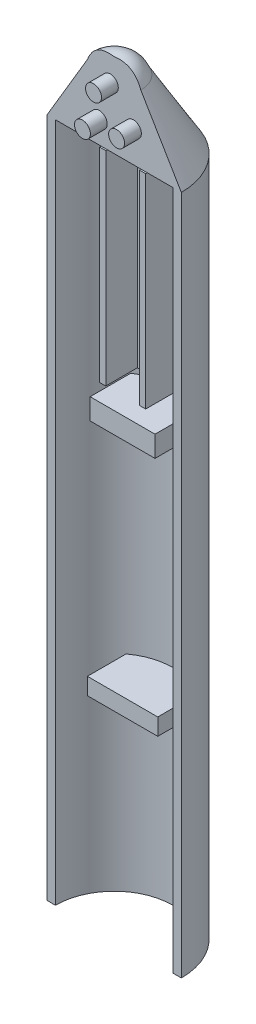
ISO-10303-21;
HEADER;
FILE_DESCRIPTION(('STEP AP214'),'2;1');
FILE_NAME('part.step','',(''),(''),'','','');
FILE_SCHEMA(('AUTOMOTIVE_DESIGN { 1 0 10303 214 1 1 1 1 }'));
ENDSEC;
DATA;
#1=APPLICATION_CONTEXT('core data for automotive mechanical design processes');
#2=APPLICATION_PROTOCOL_DEFINITION('international standard','automotive_design',2000,#1);
#3=PRODUCT_CONTEXT('',#1,'mechanical');
#4=PRODUCT('Part','Part','',(#3));
#5=PRODUCT_RELATED_PRODUCT_CATEGORY('part','',(#4));
#6=PRODUCT_DEFINITION_FORMATION('','',#4);
#7=PRODUCT_DEFINITION_CONTEXT('part definition',#1,'design');
#8=PRODUCT_DEFINITION('design','',#6,#7);
#9=PRODUCT_DEFINITION_SHAPE('','',#8);
#10=(LENGTH_UNIT() NAMED_UNIT(*) SI_UNIT(.MILLI.,.METRE.));
#11=(NAMED_UNIT(*) PLANE_ANGLE_UNIT() SI_UNIT($,.RADIAN.));
#12=(NAMED_UNIT(*) SI_UNIT($,.STERADIAN.) SOLID_ANGLE_UNIT());
#13=UNCERTAINTY_MEASURE_WITH_UNIT(LENGTH_MEASURE(1.E-05),#10,'distance_accuracy_value','');
#14=(GEOMETRIC_REPRESENTATION_CONTEXT(3) GLOBAL_UNCERTAINTY_ASSIGNED_CONTEXT((#13)) GLOBAL_UNIT_ASSIGNED_CONTEXT((#10,
#11,#12)) REPRESENTATION_CONTEXT('',''));
#15=CARTESIAN_POINT('',(0.,0.,0.));
#16=DIRECTION('',(0.,0.,1.));
#17=DIRECTION('',(1.,0.,0.));
#18=AXIS2_PLACEMENT_3D('',#15,#16,#17);
#19=CARTESIAN_POINT('',(-3.99999999999998,0.,-16.002));
#20=DIRECTION('',(1.,0.,0.));
#21=DIRECTION('',(0.,0.,-1.));
#22=AXIS2_PLACEMENT_3D('',#19,#20,#21);
#23=PLANE('',#22);
#24=DIRECTION('',(0.,0.,1.));
#25=VECTOR('',#24,1.);
#26=CARTESIAN_POINT('',(-3.99999999999998,20.0675731061453,-16.002));
#27=LINE('',#26,#25);
#28=CARTESIAN_POINT('',(-3.99999999999998,20.0675731061453,-9.5));
#29=VERTEX_POINT('',#28);
#30=CARTESIAN_POINT('',(-3.99999999999998,20.0675731061453,-2.));
#31=VERTEX_POINT('',#30);
#32=EDGE_CURVE('E61',#29,#31,#27,.T.);
#33=ORIENTED_EDGE('',*,*,#32,.F.);
#34=DIRECTION('',(0.,1.,0.));
#35=VECTOR('',#34,1.);
#36=CARTESIAN_POINT('',(-3.99999999999998,0.,-9.5));
#37=LINE('',#36,#35);
#38=CARTESIAN_POINT('',(-3.99999999999998,68.6220349905325,-9.5));
#39=VERTEX_POINT('',#38);
#40=EDGE_CURVE('E69',#29,#39,#37,.T.);
#41=ORIENTED_EDGE('',*,*,#40,.T.);
#42=DIRECTION('',(0.,0.,1.));
#43=VECTOR('',#42,1.);
#44=CARTESIAN_POINT('',(-3.99999999999998,68.6220349905325,-16.002));
#45=LINE('',#44,#43);
#46=CARTESIAN_POINT('',(-3.99999999999998,68.6220349905325,-2.));
#47=VERTEX_POINT('',#46);
#48=EDGE_CURVE('E212',#39,#47,#45,.T.);
#49=ORIENTED_EDGE('',*,*,#48,.T.);
#50=DIRECTION('',(0.,1.,0.));
#51=VECTOR('',#50,1.);
#52=CARTESIAN_POINT('',(-3.99999999999998,0.,-2.));
#53=LINE('',#52,#51);
#54=EDGE_CURVE('E232',#31,#47,#53,.T.);
#55=ORIENTED_EDGE('',*,*,#54,.F.);
#56=EDGE_LOOP('',(#33,#41,#49,#55));
#57=FACE_BOUND('',#56,.T.);
#58=ADVANCED_FACE('F50',(#57),#23,.T.);
#59=CARTESIAN_POINT('',(3.99999999999998,0.,-16.002));
#60=DIRECTION('',(1.,0.,0.));
#61=DIRECTION('',(0.,0.,-1.));
#62=AXIS2_PLACEMENT_3D('',#59,#60,#61);
#63=PLANE('',#62);
#64=DIRECTION('',(0.,1.,0.));
#65=VECTOR('',#64,1.);
#66=CARTESIAN_POINT('',(3.99999999999998,0.,-9.5));
#67=LINE('',#66,#65);
#68=CARTESIAN_POINT('',(3.99999999999998,20.0675731061453,-9.5));
#69=VERTEX_POINT('',#68);
#70=CARTESIAN_POINT('',(3.99999999999998,68.6220349905325,-9.5));
#71=VERTEX_POINT('',#70);
#72=EDGE_CURVE('E198',#69,#71,#67,.T.);
#73=ORIENTED_EDGE('',*,*,#72,.F.);
#74=DIRECTION('',(0.,0.,1.));
#75=VECTOR('',#74,1.);
#76=CARTESIAN_POINT('',(3.99999999999998,20.0675731061453,-16.002));
#77=LINE('',#76,#75);
#78=CARTESIAN_POINT('',(3.99999999999998,20.0675731061453,-2.));
#79=VERTEX_POINT('',#78);
#80=EDGE_CURVE('E320',#69,#79,#77,.T.);
#81=ORIENTED_EDGE('',*,*,#80,.T.);
#82=DIRECTION('',(0.,1.,0.));
#83=VECTOR('',#82,1.);
#84=CARTESIAN_POINT('',(3.99999999999998,0.,-2.));
#85=LINE('',#84,#83);
#86=CARTESIAN_POINT('',(3.99999999999998,68.6220349905325,-2.));
#87=VERTEX_POINT('',#86);
#88=EDGE_CURVE('E199',#79,#87,#85,.T.);
#89=ORIENTED_EDGE('',*,*,#88,.T.);
#90=DIRECTION('',(0.,0.,1.));
#91=VECTOR('',#90,1.);
#92=CARTESIAN_POINT('',(3.99999999999998,68.6220349905325,-16.002));
#93=LINE('',#92,#91);
#94=EDGE_CURVE('E195',#71,#87,#93,.T.);
#95=ORIENTED_EDGE('',*,*,#94,.F.);
#96=EDGE_LOOP('',(#73,#81,#89,#95));
#97=FACE_BOUND('',#96,.T.);
#98=ADVANCED_FACE('F191',(#97),#63,.F.);
#99=CARTESIAN_POINT('',(0.,91.,0.));
#100=DIRECTION('',(0.,1.,0.));
#101=DIRECTION('',(-1.,0.,0.));
#102=AXIS2_PLACEMENT_3D('',#99,#100,#101);
#103=CYLINDRICAL_SURFACE('',#102,14.);
#104=CARTESIAN_POINT('',(0.,-42.,0.));
#105=DIRECTION('',(0.,-1.,0.));
#106=DIRECTION('',(0.,0.,-1.));
#107=AXIS2_PLACEMENT_3D('',#104,#105,#106);
#108=CIRCLE('',#107,14.);
#109=CARTESIAN_POINT('',(-8.38159543616831,-42.,-11.2137798241451));
#110=VERTEX_POINT('',#109);
#111=CARTESIAN_POINT('',(8.38159543616828,-42.,-11.2137798241451));
#112=VERTEX_POINT('',#111);
#113=EDGE_CURVE('E286',#110,#112,#108,.T.);
#114=ORIENTED_EDGE('',*,*,#113,.T.);
#115=DIRECTION('',(0.,1.,0.));
#116=VECTOR('',#115,1.);
#117=CARTESIAN_POINT('',(8.38159543616828,91.,-11.2137798241451));
#118=LINE('',#117,#116);
#119=CARTESIAN_POINT('',(8.38159543616829,-46.,-11.2137798241451));
#120=VERTEX_POINT('',#119);
#121=EDGE_CURVE('E282',#120,#112,#118,.T.);
#122=ORIENTED_EDGE('',*,*,#121,.F.);
#123=CARTESIAN_POINT('',(0.,-46.,0.));
#124=DIRECTION('',(0.,-1.,0.));
#125=DIRECTION('',(0.,0.,-1.));
#126=AXIS2_PLACEMENT_3D('',#123,#124,#125);
#127=CIRCLE('',#126,14.);
#128=CARTESIAN_POINT('',(-8.38159543616832,-46.,-11.2137798241451));
#129=VERTEX_POINT('',#128);
#130=EDGE_CURVE('E291',#129,#120,#127,.T.);
#131=ORIENTED_EDGE('',*,*,#130,.F.);
#132=DIRECTION('',(0.,1.,0.));
#133=VECTOR('',#132,1.);
#134=CARTESIAN_POINT('',(-8.38159543616832,91.,-11.2137798241451));
#135=LINE('',#134,#133);
#136=EDGE_CURVE('E288',#129,#110,#135,.T.);
#137=ORIENTED_EDGE('',*,*,#136,.T.);
#138=EDGE_LOOP('',(#114,#122,#131,#137));
#139=FACE_BOUND('',#138,.T.);
#140=DIRECTION('',(0.,1.,0.));
#141=VECTOR('',#140,1.);
#142=CARTESIAN_POINT('',(14.,91.,0.));
#143=LINE('',#142,#141);
#144=CARTESIAN_POINT('',(14.,71.,0.));
#145=VERTEX_POINT('',#144);
#146=CARTESIAN_POINT('',(14.,-91.0399288571137,0.));
#147=VERTEX_POINT('',#146);
#148=EDGE_CURVE('E373',#145,#147,#143,.F.);
#149=ORIENTED_EDGE('',*,*,#148,.F.);
#150=CARTESIAN_POINT('',(0.,71.,0.));
#151=DIRECTION('',(0.,1.,0.));
#152=DIRECTION('',(-1.,0.,0.));
#153=AXIS2_PLACEMENT_3D('',#150,#151,#152);
#154=CIRCLE('',#153,14.);
#155=CARTESIAN_POINT('',(-14.,71.,0.));
#156=VERTEX_POINT('',#155);
#157=EDGE_CURVE('E60',#145,#156,#154,.T.);
#158=ORIENTED_EDGE('',*,*,#157,.T.);
#159=DIRECTION('',(0.,1.,0.));
#160=VECTOR('',#159,1.);
#161=CARTESIAN_POINT('',(-14.,91.,0.));
#162=LINE('',#161,#160);
#163=CARTESIAN_POINT('',(-14.,-91.0399288571137,0.));
#164=VERTEX_POINT('',#163);
#165=EDGE_CURVE('E359',#164,#156,#162,.T.);
#166=ORIENTED_EDGE('',*,*,#165,.F.);
#167=CARTESIAN_POINT('',(0.,-91.0399288571137,0.));
#168=DIRECTION('',(0.,1.,0.));
#169=DIRECTION('',(-1.,0.,0.));
#170=AXIS2_PLACEMENT_3D('',#167,#168,#169);
#171=CIRCLE('',#170,14.);
#172=EDGE_CURVE('E403',#147,#164,#171,.T.);
#173=ORIENTED_EDGE('',*,*,#172,.F.);
#174=EDGE_LOOP('',(#149,#158,#166,#173));
#175=FACE_BOUND('',#174,.T.);
#176=CARTESIAN_POINT('',(0.,16.,0.));
#177=DIRECTION('',(0.,-1.,0.));
#178=DIRECTION('',(1.,0.,0.));
#179=AXIS2_PLACEMENT_3D('',#176,#177,#178);
#180=CIRCLE('',#179,14.);
#181=CARTESIAN_POINT('',(-7.72890663595341,16.,-11.6732173034137));
#182=VERTEX_POINT('',#181);
#183=CARTESIAN_POINT('',(7.72890663595337,16.,-11.6732173034137));
#184=VERTEX_POINT('',#183);
#185=EDGE_CURVE('E363',#182,#184,#180,.T.);
#186=ORIENTED_EDGE('',*,*,#185,.T.);
#187=DIRECTION('',(0.,1.,0.));
#188=VECTOR('',#187,1.);
#189=CARTESIAN_POINT('',(7.72890663595337,91.,-11.6732173034136));
#190=LINE('',#189,#188);
#191=CARTESIAN_POINT('',(7.72890663595338,11.,-11.6732173034137));
#192=VERTEX_POINT('',#191);
#193=EDGE_CURVE('E358',#192,#184,#190,.T.);
#194=ORIENTED_EDGE('',*,*,#193,.F.);
#195=CARTESIAN_POINT('',(0.,11.,0.));
#196=DIRECTION('',(0.,-1.,0.));
#197=DIRECTION('',(1.,0.,0.));
#198=AXIS2_PLACEMENT_3D('',#195,#196,#197);
#199=CIRCLE('',#198,14.);
#200=CARTESIAN_POINT('',(-7.72890663595342,11.,-11.6732173034137));
#201=VERTEX_POINT('',#200);
#202=EDGE_CURVE('E364',#201,#192,#199,.T.);
#203=ORIENTED_EDGE('',*,*,#202,.F.);
#204=DIRECTION('',(0.,1.,0.));
#205=VECTOR('',#204,1.);
#206=CARTESIAN_POINT('',(-7.72890663595342,91.,-11.6732173034137));
#207=LINE('',#206,#205);
#208=EDGE_CURVE('E357',#201,#182,#207,.T.);
#209=ORIENTED_EDGE('',*,*,#208,.T.);
#210=EDGE_LOOP('',(#186,#194,#203,#209));
#211=FACE_BOUND('',#210,.T.);
#212=DIRECTION('',(0.,1.,0.));
#213=VECTOR('',#212,1.);
#214=CARTESIAN_POINT('',(-5.49999999999998,91.,-12.8743931895838));
#215=LINE('',#214,#213);
#216=CARTESIAN_POINT('',(-5.49999999999997,20.0675731061453,-12.8743931895838));
#217=VERTEX_POINT('',#216);
#218=CARTESIAN_POINT('',(-5.49999999999998,68.6220349905325,-12.8743931895838));
#219=VERTEX_POINT('',#218);
#220=EDGE_CURVE('E255',#217,#219,#215,.T.);
#221=ORIENTED_EDGE('',*,*,#220,.T.);
#222=CARTESIAN_POINT('',(0.,68.6220349905325,0.));
#223=DIRECTION('',(0.,1.,0.));
#224=DIRECTION('',(0.,0.,1.));
#225=AXIS2_PLACEMENT_3D('',#222,#223,#224);
#226=CIRCLE('',#225,14.);
#227=CARTESIAN_POINT('',(5.49999999999998,68.6220349905325,-12.8743931895837));
#228=VERTEX_POINT('',#227);
#229=EDGE_CURVE('E318',#228,#219,#226,.T.);
#230=ORIENTED_EDGE('',*,*,#229,.F.);
#231=DIRECTION('',(0.,1.,0.));
#232=VECTOR('',#231,1.);
#233=CARTESIAN_POINT('',(5.49999999999998,91.,-12.8743931895837));
#234=LINE('',#233,#232);
#235=CARTESIAN_POINT('',(5.49999999999998,20.0675731061453,-12.8743931895837));
#236=VERTEX_POINT('',#235);
#237=EDGE_CURVE('E324',#236,#228,#234,.T.);
#238=ORIENTED_EDGE('',*,*,#237,.F.);
#239=CARTESIAN_POINT('',(0.,20.0675731061453,0.));
#240=DIRECTION('',(0.,1.,0.));
#241=DIRECTION('',(-1.,0.,0.));
#242=AXIS2_PLACEMENT_3D('',#239,#240,#241);
#243=CIRCLE('',#242,14.);
#244=EDGE_CURVE('E263',#236,#217,#243,.T.);
#245=ORIENTED_EDGE('',*,*,#244,.T.);
#246=EDGE_LOOP('',(#221,#230,#238,#245));
#247=FACE_BOUND('',#246,.T.);
#248=ADVANCED_FACE('F434',(#139,#175,#211,#247),#103,.F.);
#249=CARTESIAN_POINT('',(6.354000148981,87.2790396922268,0.));
#250=CARTESIAN_POINT('',(4.66858918472638,91.7236423414879,0.));
#251=CARTESIAN_POINT('',(0.,91.,0.));
#252=B_SPLINE_CURVE_WITH_KNOTS('',2,(#249,#250,#251),.UNSPECIFIED.,.F.,.F.,(3,3),(0.,1.),.UNSPECIFIED.);
#253=CARTESIAN_POINT('',(0.,91.,0.));
#254=DIRECTION('',(0.,1.,0.));
#255=AXIS1_PLACEMENT('',#253,#254);
#256=SURFACE_OF_REVOLUTION('',#252,#255);
#257=CARTESIAN_POINT('',(6.354000148981,87.2790396922268,0.));
#258=CARTESIAN_POINT('',(4.66858918472638,91.7236423414879,0.));
#259=CARTESIAN_POINT('',(0.,91.,0.));
#260=B_SPLINE_CURVE_WITH_KNOTS('',2,(#257,#258,#259),.UNSPECIFIED.,.F.,.F.,(3,3),(0.,1.),.UNSPECIFIED.);
#261=CARTESIAN_POINT('',(6.354000148981,87.2790396922268,0.));
#262=VERTEX_POINT('',#261);
#263=CARTESIAN_POINT('',(0.,91.,0.));
#264=VERTEX_POINT('',#263);
#265=EDGE_CURVE('E399',#262,#264,#260,.T.);
#266=ORIENTED_EDGE('',*,*,#265,.F.);
#267=CARTESIAN_POINT('',(0.,87.2790396922268,0.));
#268=DIRECTION('',(0.,1.,0.));
#269=DIRECTION('',(-1.,0.,0.));
#270=AXIS2_PLACEMENT_3D('',#267,#268,#269);
#271=CIRCLE('',#270,6.35400014898102);
#272=CARTESIAN_POINT('',(-6.35400014898104,87.2790396922268,0.));
#273=VERTEX_POINT('',#272);
#274=EDGE_CURVE('E420',#262,#273,#271,.T.);
#275=ORIENTED_EDGE('',*,*,#274,.T.);
#276=CARTESIAN_POINT('',(-6.35400014898105,87.2790396922268,0.));
#277=CARTESIAN_POINT('',(-4.66858918472643,91.7236423414879,0.));
#278=CARTESIAN_POINT('',(0.,91.,0.));
#279=B_SPLINE_CURVE_WITH_KNOTS('',2,(#276,#277,#278),.UNSPECIFIED.,.F.,.F.,(3,3),(0.,1.),.UNSPECIFIED.);
#280=EDGE_CURVE('E395',#264,#273,#279,.F.);
#281=ORIENTED_EDGE('',*,*,#280,.F.);
#282=EDGE_LOOP('',(#266,#275,#281));
#283=FACE_BOUND('',#282,.T.);
#284=ADVANCED_FACE('F47',(#283),#256,.T.);
#285=CARTESIAN_POINT('',(0.,71.,0.));
#286=DIRECTION('',(0.,-1.,0.));
#287=DIRECTION('',(1.,0.,0.));
#288=AXIS2_PLACEMENT_3D('',#285,#286,#287);
#289=CONICAL_SURFACE('',#288,16.,0.534916952487725);
#290=DIRECTION('',(-0.50976959450107,-0.860310967338099,0.));
#291=VECTOR('',#290,1.);
#292=CARTESIAN_POINT('',(0.,98.0023469934135,0.));
#293=LINE('',#292,#291);
#294=CARTESIAN_POINT('',(-16.,71.,0.));
#295=VERTEX_POINT('',#294);
#296=EDGE_CURVE('E386',#273,#295,#293,.T.);
#297=ORIENTED_EDGE('',*,*,#296,.F.);
#298=ORIENTED_EDGE('',*,*,#274,.F.);
#299=DIRECTION('',(-0.50976959450107,0.860310967338099,0.));
#300=VECTOR('',#299,1.);
#301=CARTESIAN_POINT('',(0.,98.0023469934135,0.));
#302=LINE('',#301,#300);
#303=CARTESIAN_POINT('',(16.,71.,0.));
#304=VERTEX_POINT('',#303);
#305=EDGE_CURVE('E387',#304,#262,#302,.T.);
#306=ORIENTED_EDGE('',*,*,#305,.F.);
#307=CARTESIAN_POINT('',(0.,71.,0.));
#308=DIRECTION('',(0.,1.,0.));
#309=DIRECTION('',(-1.,0.,0.));
#310=AXIS2_PLACEMENT_3D('',#307,#308,#309);
#311=CIRCLE('',#310,16.);
#312=EDGE_CURVE('E418',#304,#295,#311,.T.);
#313=ORIENTED_EDGE('',*,*,#312,.T.);
#314=EDGE_LOOP('',(#297,#298,#306,#313));
#315=FACE_BOUND('',#314,.T.);
#316=ADVANCED_FACE('F459',(#315),#289,.T.);
#317=CARTESIAN_POINT('',(0.,91.,0.));
#318=DIRECTION('',(0.,1.,0.));
#319=DIRECTION('',(-1.,0.,0.));
#320=AXIS2_PLACEMENT_3D('',#317,#318,#319);
#321=CYLINDRICAL_SURFACE('',#320,16.);
#322=DIRECTION('',(0.,1.,0.));
#323=VECTOR('',#322,1.);
#324=CARTESIAN_POINT('',(16.,91.,0.));
#325=LINE('',#324,#323);
#326=CARTESIAN_POINT('',(16.,-91.0399288571137,0.));
#327=VERTEX_POINT('',#326);
#328=EDGE_CURVE('E384',#327,#304,#325,.T.);
#329=ORIENTED_EDGE('',*,*,#328,.F.);
#330=CARTESIAN_POINT('',(0.,-91.0399288571137,0.));
#331=DIRECTION('',(0.,1.,0.));
#332=DIRECTION('',(-1.,0.,0.));
#333=AXIS2_PLACEMENT_3D('',#330,#331,#332);
#334=CIRCLE('',#333,16.);
#335=CARTESIAN_POINT('',(-16.,-91.0399288571137,0.));
#336=VERTEX_POINT('',#335);
#337=EDGE_CURVE('E415',#327,#336,#334,.T.);
#338=ORIENTED_EDGE('',*,*,#337,.T.);
#339=DIRECTION('',(0.,1.,0.));
#340=VECTOR('',#339,1.);
#341=CARTESIAN_POINT('',(-16.,91.,0.));
#342=LINE('',#341,#340);
#343=EDGE_CURVE('E379',#295,#336,#342,.F.);
#344=ORIENTED_EDGE('',*,*,#343,.F.);
#345=ORIENTED_EDGE('',*,*,#312,.F.);
#346=EDGE_LOOP('',(#329,#338,#344,#345));
#347=FACE_BOUND('',#346,.T.);
#348=ADVANCED_FACE('F455',(#347),#321,.T.);
#349=CARTESIAN_POINT('',(16.,-91.0399288571137,0.));
#350=DIRECTION('',(0.,1.,0.));
#351=DIRECTION('',(-1.,0.,0.));
#352=AXIS2_PLACEMENT_3D('',#349,#350,#351);
#353=PLANE('',#352);
#354=DIRECTION('',(1.,0.,0.));
#355=VECTOR('',#354,1.);
#356=CARTESIAN_POINT('',(16.,-91.0399288571137,0.));
#357=LINE('',#356,#355);
#358=EDGE_CURVE('E378',#336,#164,#357,.T.);
#359=ORIENTED_EDGE('',*,*,#358,.F.);
#360=ORIENTED_EDGE('',*,*,#337,.F.);
#361=EDGE_CURVE('E376',#147,#327,#357,.T.);
#362=ORIENTED_EDGE('',*,*,#361,.F.);
#363=ORIENTED_EDGE('',*,*,#172,.T.);
#364=EDGE_LOOP('',(#359,#360,#362,#363));
#365=FACE_BOUND('',#364,.T.);
#366=ADVANCED_FACE('F446',(#365),#353,.F.);
#367=CARTESIAN_POINT('',(16.,71.,0.));
#368=DIRECTION('',(0.,1.,0.));
#369=DIRECTION('',(-1.,0.,0.));
#370=AXIS2_PLACEMENT_3D('',#367,#368,#369);
#371=PLANE('',#370);
#372=DIRECTION('',(1.,0.,0.));
#373=VECTOR('',#372,1.);
#374=CARTESIAN_POINT('',(16.,71.,0.));
#375=LINE('',#374,#373);
#376=EDGE_CURVE('E11',#156,#145,#375,.T.);
#377=ORIENTED_EDGE('',*,*,#376,.F.);
#378=ORIENTED_EDGE('',*,*,#157,.F.);
#379=EDGE_LOOP('',(#377,#378));
#380=FACE_BOUND('',#379,.T.);
#381=ADVANCED_FACE('F439',(#380),#371,.F.);
#382=CARTESIAN_POINT('',(0.,0.,0.));
#383=DIRECTION('',(0.,0.,1.));
#384=DIRECTION('',(1.,0.,0.));
#385=AXIS2_PLACEMENT_3D('',#382,#383,#384);
#386=PLANE('',#385);
#387=CARTESIAN_POINT('',(4.57930185841874,78.3675125372892,0.));
#388=DIRECTION('',(0.,0.,1.));
#389=DIRECTION('',(1.,0.,0.));
#390=AXIS2_PLACEMENT_3D('',#387,#388,#389);
#391=CIRCLE('',#390,1.9);
#392=CARTESIAN_POINT('',(6.47930185841874,78.3675125372892,0.));
#393=VERTEX_POINT('',#392);
#394=EDGE_CURVE('E733',#393,#393,#391,.T.);
#395=ORIENTED_EDGE('',*,*,#394,.F.);
#396=EDGE_LOOP('',(#395));
#397=FACE_BOUND('',#396,.T.);
#398=CARTESIAN_POINT('',(-3.55851338451132,76.2554078177501,0.));
#399=DIRECTION('',(0.,0.,1.));
#400=DIRECTION('',(1.,0.,0.));
#401=AXIS2_PLACEMENT_3D('',#398,#399,#400);
#402=CIRCLE('',#401,1.9);
#403=CARTESIAN_POINT('',(-1.65851338451132,76.2554078177501,0.));
#404=VERTEX_POINT('',#403);
#405=EDGE_CURVE('E739',#404,#404,#402,.T.);
#406=ORIENTED_EDGE('',*,*,#405,.F.);
#407=EDGE_LOOP('',(#406));
#408=FACE_BOUND('',#407,.T.);
#409=CARTESIAN_POINT('',(-0.919296183297679,85.0765510581781,0.));
#410=DIRECTION('',(0.,0.,1.));
#411=DIRECTION('',(1.,0.,0.));
#412=AXIS2_PLACEMENT_3D('',#409,#410,#411);
#413=CIRCLE('',#412,1.9);
#414=CARTESIAN_POINT('',(0.980703816702321,85.0765510581781,0.));
#415=VERTEX_POINT('',#414);
#416=EDGE_CURVE('E750',#415,#415,#413,.T.);
#417=ORIENTED_EDGE('',*,*,#416,.F.);
#418=EDGE_LOOP('',(#417));
#419=FACE_BOUND('',#418,.T.);
#420=ORIENTED_EDGE('',*,*,#265,.T.);
#421=ORIENTED_EDGE('',*,*,#280,.T.);
#422=ORIENTED_EDGE('',*,*,#296,.T.);
#423=ORIENTED_EDGE('',*,*,#343,.T.);
#424=ORIENTED_EDGE('',*,*,#358,.T.);
#425=ORIENTED_EDGE('',*,*,#165,.T.);
#426=ORIENTED_EDGE('',*,*,#376,.T.);
#427=ORIENTED_EDGE('',*,*,#148,.T.);
#428=ORIENTED_EDGE('',*,*,#361,.T.);
#429=ORIENTED_EDGE('',*,*,#328,.T.);
#430=ORIENTED_EDGE('',*,*,#305,.T.);
#431=EDGE_LOOP('',(#420,#421,#422,#423,#424,#425,#426,#427,#428,#429,#430));
#432=FACE_BOUND('',#431,.T.);
#433=ADVANCED_FACE('F445',(#397,#408,#419,#432),#386,.T.);
#434=CARTESIAN_POINT('',(7.72890663595337,0.,-16.002));
#435=DIRECTION('',(1.,0.,0.));
#436=DIRECTION('',(0.,0.,-1.));
#437=AXIS2_PLACEMENT_3D('',#434,#435,#436);
#438=PLANE('',#437);
#439=DIRECTION('',(0.,0.,1.));
#440=VECTOR('',#439,1.);
#441=CARTESIAN_POINT('',(7.72890663595337,11.,-16.002));
#442=LINE('',#441,#440);
#443=CARTESIAN_POINT('',(7.72890663595337,11.,-2.));
#444=VERTEX_POINT('',#443);
#445=EDGE_CURVE('E352',#192,#444,#442,.T.);
#446=ORIENTED_EDGE('',*,*,#445,.F.);
#447=ORIENTED_EDGE('',*,*,#193,.T.);
#448=DIRECTION('',(0.,0.,1.));
#449=VECTOR('',#448,1.);
#450=CARTESIAN_POINT('',(7.72890663595337,16.,-16.002));
#451=LINE('',#450,#449);
#452=CARTESIAN_POINT('',(7.72890663595337,16.,-2.));
#453=VERTEX_POINT('',#452);
#454=EDGE_CURVE('E347',#184,#453,#451,.T.);
#455=ORIENTED_EDGE('',*,*,#454,.T.);
#456=DIRECTION('',(0.,1.,0.));
#457=VECTOR('',#456,1.);
#458=CARTESIAN_POINT('',(7.72890663595337,0.,-2.));
#459=LINE('',#458,#457);
#460=EDGE_CURVE('E334',#444,#453,#459,.T.);
#461=ORIENTED_EDGE('',*,*,#460,.F.);
#462=EDGE_LOOP('',(#446,#447,#455,#461));
#463=FACE_BOUND('',#462,.T.);
#464=ADVANCED_FACE('F488',(#463),#438,.T.);
#465=CARTESIAN_POINT('',(0.,16.,-16.002));
#466=DIRECTION('',(0.,-1.,0.));
#467=DIRECTION('',(1.,0.,0.));
#468=AXIS2_PLACEMENT_3D('',#465,#466,#467);
#469=PLANE('',#468);
#470=ORIENTED_EDGE('',*,*,#185,.F.);
#471=DIRECTION('',(0.,0.,1.));
#472=VECTOR('',#471,1.);
#473=CARTESIAN_POINT('',(-7.72890663595342,16.,-16.002));
#474=LINE('',#473,#472);
#475=CARTESIAN_POINT('',(-7.72890663595342,16.,-2.));
#476=VERTEX_POINT('',#475);
#477=EDGE_CURVE('E350',#182,#476,#474,.T.);
#478=ORIENTED_EDGE('',*,*,#477,.T.);
#479=DIRECTION('',(1.,0.,0.));
#480=VECTOR('',#479,1.);
#481=CARTESIAN_POINT('',(0.,16.,-2.));
#482=LINE('',#481,#480);
#483=EDGE_CURVE('E337',#476,#453,#482,.T.);
#484=ORIENTED_EDGE('',*,*,#483,.T.);
#485=ORIENTED_EDGE('',*,*,#454,.F.);
#486=EDGE_LOOP('',(#470,#478,#484,#485));
#487=FACE_BOUND('',#486,.T.);
#488=ADVANCED_FACE('F521',(#487),#469,.F.);
#489=CARTESIAN_POINT('',(0.,0.,-2.));
#490=DIRECTION('',(0.,0.,1.));
#491=DIRECTION('',(1.,0.,0.));
#492=AXIS2_PLACEMENT_3D('',#489,#490,#491);
#493=PLANE('',#492);
#494=DIRECTION('',(1.,0.,0.));
#495=VECTOR('',#494,1.);
#496=CARTESIAN_POINT('',(0.,11.,-2.));
#497=LINE('',#496,#495);
#498=CARTESIAN_POINT('',(-7.72890663595342,11.,-2.));
#499=VERTEX_POINT('',#498);
#500=EDGE_CURVE('E290',#499,#444,#497,.T.);
#501=ORIENTED_EDGE('',*,*,#500,.T.);
#502=ORIENTED_EDGE('',*,*,#460,.T.);
#503=ORIENTED_EDGE('',*,*,#483,.F.);
#504=DIRECTION('',(0.,1.,0.));
#505=VECTOR('',#504,1.);
#506=CARTESIAN_POINT('',(-7.72890663595342,0.,-2.));
#507=LINE('',#506,#505);
#508=EDGE_CURVE('E338',#499,#476,#507,.T.);
#509=ORIENTED_EDGE('',*,*,#508,.F.);
#510=EDGE_LOOP('',(#501,#502,#503,#509));
#511=FACE_BOUND('',#510,.T.);
#512=ADVANCED_FACE('F516',(#511),#493,.T.);
#513=CARTESIAN_POINT('',(0.,11.,-16.002));
#514=DIRECTION('',(0.,-1.,0.));
#515=DIRECTION('',(1.,0.,0.));
#516=AXIS2_PLACEMENT_3D('',#513,#514,#515);
#517=PLANE('',#516);
#518=DIRECTION('',(0.,0.,1.));
#519=VECTOR('',#518,1.);
#520=CARTESIAN_POINT('',(-7.72890663595342,11.,-16.002));
#521=LINE('',#520,#519);
#522=EDGE_CURVE('E341',#201,#499,#521,.T.);
#523=ORIENTED_EDGE('',*,*,#522,.F.);
#524=ORIENTED_EDGE('',*,*,#202,.T.);
#525=ORIENTED_EDGE('',*,*,#445,.T.);
#526=ORIENTED_EDGE('',*,*,#500,.F.);
#527=EDGE_LOOP('',(#523,#524,#525,#526));
#528=FACE_BOUND('',#527,.T.);
#529=ADVANCED_FACE('F525',(#528),#517,.T.);
#530=CARTESIAN_POINT('',(-7.72890663595342,0.,-16.002));
#531=DIRECTION('',(1.,0.,0.));
#532=DIRECTION('',(0.,0.,-1.));
#533=AXIS2_PLACEMENT_3D('',#530,#531,#532);
#534=PLANE('',#533);
#535=ORIENTED_EDGE('',*,*,#208,.F.);
#536=ORIENTED_EDGE('',*,*,#522,.T.);
#537=ORIENTED_EDGE('',*,*,#508,.T.);
#538=ORIENTED_EDGE('',*,*,#477,.F.);
#539=EDGE_LOOP('',(#535,#536,#537,#538));
#540=FACE_BOUND('',#539,.T.);
#541=ADVANCED_FACE('F522',(#540),#534,.F.);
#542=CARTESIAN_POINT('',(0.,0.,-2.));
#543=DIRECTION('',(0.,0.,1.));
#544=DIRECTION('',(1.,0.,0.));
#545=AXIS2_PLACEMENT_3D('',#542,#543,#544);
#546=PLANE('',#545);
#547=DIRECTION('',(0.,1.,0.));
#548=VECTOR('',#547,1.);
#549=CARTESIAN_POINT('',(-5.49999999999998,0.,-2.));
#550=LINE('',#549,#548);
#551=CARTESIAN_POINT('',(-5.49999999999998,20.0675731061453,-2.));
#552=VERTEX_POINT('',#551);
#553=CARTESIAN_POINT('',(-5.49999999999998,68.6220349905325,-2.));
#554=VERTEX_POINT('',#553);
#555=EDGE_CURVE('E227',#552,#554,#550,.T.);
#556=ORIENTED_EDGE('',*,*,#555,.F.);
#557=DIRECTION('',(1.,0.,0.));
#558=VECTOR('',#557,1.);
#559=CARTESIAN_POINT('',(1.39246760692444E-13,20.0675731061453,-2.));
#560=LINE('',#559,#558);
#561=EDGE_CURVE('E233',#552,#31,#560,.T.);
#562=ORIENTED_EDGE('',*,*,#561,.T.);
#563=ORIENTED_EDGE('',*,*,#54,.T.);
#564=DIRECTION('',(1.,0.,0.));
#565=VECTOR('',#564,1.);
#566=CARTESIAN_POINT('',(0.,68.6220349905325,-2.));
#567=LINE('',#566,#565);
#568=EDGE_CURVE('E237',#554,#47,#567,.T.);
#569=ORIENTED_EDGE('',*,*,#568,.F.);
#570=EDGE_LOOP('',(#556,#562,#563,#569));
#571=FACE_BOUND('',#570,.T.);
#572=ADVANCED_FACE('F479',(#571),#546,.T.);
#573=CARTESIAN_POINT('',(-5.49999999999998,0.,-16.002));
#574=DIRECTION('',(1.,0.,0.));
#575=DIRECTION('',(0.,0.,-1.));
#576=AXIS2_PLACEMENT_3D('',#573,#574,#575);
#577=PLANE('',#576);
#578=ORIENTED_EDGE('',*,*,#220,.F.);
#579=DIRECTION('',(0.,0.,1.));
#580=VECTOR('',#579,1.);
#581=CARTESIAN_POINT('',(-5.49999999999998,20.0675731061453,-16.002));
#582=LINE('',#581,#580);
#583=EDGE_CURVE('E248',#217,#552,#582,.T.);
#584=ORIENTED_EDGE('',*,*,#583,.T.);
#585=ORIENTED_EDGE('',*,*,#555,.T.);
#586=DIRECTION('',(0.,0.,1.));
#587=VECTOR('',#586,1.);
#588=CARTESIAN_POINT('',(-5.49999999999998,68.6220349905325,-16.002));
#589=LINE('',#588,#587);
#590=EDGE_CURVE('E245',#219,#554,#589,.T.);
#591=ORIENTED_EDGE('',*,*,#590,.F.);
#592=EDGE_LOOP('',(#578,#584,#585,#591));
#593=FACE_BOUND('',#592,.T.);
#594=ADVANCED_FACE('F483',(#593),#577,.F.);
#595=CARTESIAN_POINT('',(-1.39246760692444E-13,20.0675731061453,-16.002));
#596=DIRECTION('',(0.,1.,0.));
#597=DIRECTION('',(-1.,0.,0.));
#598=AXIS2_PLACEMENT_3D('',#595,#596,#597);
#599=PLANE('',#598);
#600=ORIENTED_EDGE('',*,*,#244,.F.);
#601=DIRECTION('',(0.,0.,1.));
#602=VECTOR('',#601,1.);
#603=CARTESIAN_POINT('',(5.49999999999998,20.0675731061453,-16.002));
#604=LINE('',#603,#602);
#605=CARTESIAN_POINT('',(5.49999999999998,20.0675731061453,-2.));
#606=VERTEX_POINT('',#605);
#607=EDGE_CURVE('E313',#236,#606,#604,.T.);
#608=ORIENTED_EDGE('',*,*,#607,.T.);
#609=DIRECTION('',(-1.,0.,0.));
#610=VECTOR('',#609,1.);
#611=CARTESIAN_POINT('',(-1.39246760692444E-13,20.0675731061453,-2.));
#612=LINE('',#611,#610);
#613=EDGE_CURVE('E305',#606,#79,#612,.T.);
#614=ORIENTED_EDGE('',*,*,#613,.T.);
#615=ORIENTED_EDGE('',*,*,#80,.F.);
#616=DIRECTION('',(1.,0.,0.));
#617=VECTOR('',#616,1.);
#618=CARTESIAN_POINT('',(0.,20.0675731061453,-9.5));
#619=LINE('',#618,#617);
#620=EDGE_CURVE('E216',#29,#69,#619,.T.);
#621=ORIENTED_EDGE('',*,*,#620,.F.);
#622=ORIENTED_EDGE('',*,*,#32,.T.);
#623=ORIENTED_EDGE('',*,*,#561,.F.);
#624=ORIENTED_EDGE('',*,*,#583,.F.);
#625=EDGE_LOOP('',(#600,#608,#614,#615,#621,#622,#623,#624));
#626=FACE_BOUND('',#625,.T.);
#627=ADVANCED_FACE('F485',(#626),#599,.F.);
#628=CARTESIAN_POINT('',(0.,0.,-2.));
#629=DIRECTION('',(0.,0.,1.));
#630=DIRECTION('',(1.,0.,0.));
#631=AXIS2_PLACEMENT_3D('',#628,#629,#630);
#632=PLANE('',#631);
#633=ORIENTED_EDGE('',*,*,#88,.F.);
#634=ORIENTED_EDGE('',*,*,#613,.F.);
#635=DIRECTION('',(0.,1.,0.));
#636=VECTOR('',#635,1.);
#637=CARTESIAN_POINT('',(5.49999999999998,0.,-2.));
#638=LINE('',#637,#636);
#639=CARTESIAN_POINT('',(5.49999999999998,68.6220349905325,-2.));
#640=VERTEX_POINT('',#639);
#641=EDGE_CURVE('E306',#606,#640,#638,.T.);
#642=ORIENTED_EDGE('',*,*,#641,.T.);
#643=DIRECTION('',(-1.,0.,0.));
#644=VECTOR('',#643,1.);
#645=CARTESIAN_POINT('',(0.,68.6220349905325,-2.));
#646=LINE('',#645,#644);
#647=EDGE_CURVE('E201',#640,#87,#646,.T.);
#648=ORIENTED_EDGE('',*,*,#647,.T.);
#649=EDGE_LOOP('',(#633,#634,#642,#648));
#650=FACE_BOUND('',#649,.T.);
#651=ADVANCED_FACE('F506',(#650),#632,.T.);
#652=CARTESIAN_POINT('',(5.49999999999998,0.,-16.002));
#653=DIRECTION('',(1.,0.,0.));
#654=DIRECTION('',(0.,0.,-1.));
#655=AXIS2_PLACEMENT_3D('',#652,#653,#654);
#656=PLANE('',#655);
#657=ORIENTED_EDGE('',*,*,#607,.F.);
#658=ORIENTED_EDGE('',*,*,#237,.T.);
#659=DIRECTION('',(0.,0.,1.));
#660=VECTOR('',#659,1.);
#661=CARTESIAN_POINT('',(5.49999999999998,68.6220349905325,-16.002));
#662=LINE('',#661,#660);
#663=EDGE_CURVE('E205',#228,#640,#662,.T.);
#664=ORIENTED_EDGE('',*,*,#663,.T.);
#665=ORIENTED_EDGE('',*,*,#641,.F.);
#666=EDGE_LOOP('',(#657,#658,#664,#665));
#667=FACE_BOUND('',#666,.T.);
#668=ADVANCED_FACE('F508',(#667),#656,.T.);
#669=CARTESIAN_POINT('',(0.,68.6220349905325,-16.002));
#670=DIRECTION('',(0.,1.,0.));
#671=DIRECTION('',(0.,0.,1.));
#672=AXIS2_PLACEMENT_3D('',#669,#670,#671);
#673=PLANE('',#672);
#674=ORIENTED_EDGE('',*,*,#663,.F.);
#675=ORIENTED_EDGE('',*,*,#229,.T.);
#676=ORIENTED_EDGE('',*,*,#590,.T.);
#677=ORIENTED_EDGE('',*,*,#568,.T.);
#678=ORIENTED_EDGE('',*,*,#48,.F.);
#679=DIRECTION('',(1.,0.,0.));
#680=VECTOR('',#679,1.);
#681=CARTESIAN_POINT('',(0.,68.6220349905325,-9.5));
#682=LINE('',#681,#680);
#683=EDGE_CURVE('E206',#39,#71,#682,.T.);
#684=ORIENTED_EDGE('',*,*,#683,.T.);
#685=ORIENTED_EDGE('',*,*,#94,.T.);
#686=ORIENTED_EDGE('',*,*,#647,.F.);
#687=EDGE_LOOP('',(#674,#675,#676,#677,#678,#684,#685,#686));
#688=FACE_BOUND('',#687,.T.);
#689=ADVANCED_FACE('F209',(#688),#673,.T.);
#690=CARTESIAN_POINT('',(8.38159543616828,0.,-16.002));
#691=DIRECTION('',(1.,0.,0.));
#692=DIRECTION('',(0.,0.,-1.));
#693=AXIS2_PLACEMENT_3D('',#690,#691,#692);
#694=PLANE('',#693);
#695=DIRECTION('',(0.,0.,1.));
#696=VECTOR('',#695,1.);
#697=CARTESIAN_POINT('',(8.38159543616828,-46.,-16.002));
#698=LINE('',#697,#696);
#699=CARTESIAN_POINT('',(8.38159543616828,-46.,-2.));
#700=VERTEX_POINT('',#699);
#701=EDGE_CURVE('E285',#120,#700,#698,.T.);
#702=ORIENTED_EDGE('',*,*,#701,.F.);
#703=ORIENTED_EDGE('',*,*,#121,.T.);
#704=DIRECTION('',(0.,0.,1.));
#705=VECTOR('',#704,1.);
#706=CARTESIAN_POINT('',(8.38159543616828,-42.,-16.002));
#707=LINE('',#706,#705);
#708=CARTESIAN_POINT('',(8.38159543616828,-42.,-2.));
#709=VERTEX_POINT('',#708);
#710=EDGE_CURVE('E276',#112,#709,#707,.T.);
#711=ORIENTED_EDGE('',*,*,#710,.T.);
#712=DIRECTION('',(0.,1.,0.));
#713=VECTOR('',#712,1.);
#714=CARTESIAN_POINT('',(8.38159543616828,0.,-2.));
#715=LINE('',#714,#713);
#716=EDGE_CURVE('E258',#700,#709,#715,.T.);
#717=ORIENTED_EDGE('',*,*,#716,.F.);
#718=EDGE_LOOP('',(#702,#703,#711,#717));
#719=FACE_BOUND('',#718,.T.);
#720=ADVANCED_FACE('F498',(#719),#694,.T.);
#721=CARTESIAN_POINT('',(0.,-42.,-16.002));
#722=DIRECTION('',(0.,-1.,0.));
#723=DIRECTION('',(0.,0.,-1.));
#724=AXIS2_PLACEMENT_3D('',#721,#722,#723);
#725=PLANE('',#724);
#726=ORIENTED_EDGE('',*,*,#113,.F.);
#727=DIRECTION('',(0.,0.,1.));
#728=VECTOR('',#727,1.);
#729=CARTESIAN_POINT('',(-8.38159543616832,-42.,-16.002));
#730=LINE('',#729,#728);
#731=CARTESIAN_POINT('',(-8.38159543616832,-42.,-2.));
#732=VERTEX_POINT('',#731);
#733=EDGE_CURVE('E277',#110,#732,#730,.T.);
#734=ORIENTED_EDGE('',*,*,#733,.T.);
#735=DIRECTION('',(1.,0.,0.));
#736=VECTOR('',#735,1.);
#737=CARTESIAN_POINT('',(0.,-42.,-2.));
#738=LINE('',#737,#736);
#739=EDGE_CURVE('E262',#732,#709,#738,.T.);
#740=ORIENTED_EDGE('',*,*,#739,.T.);
#741=ORIENTED_EDGE('',*,*,#710,.F.);
#742=EDGE_LOOP('',(#726,#734,#740,#741));
#743=FACE_BOUND('',#742,.T.);
#744=ADVANCED_FACE('F493',(#743),#725,.F.);
#745=CARTESIAN_POINT('',(0.,0.,-2.));
#746=DIRECTION('',(0.,0.,1.));
#747=DIRECTION('',(1.,0.,0.));
#748=AXIS2_PLACEMENT_3D('',#745,#746,#747);
#749=PLANE('',#748);
#750=DIRECTION('',(1.,0.,0.));
#751=VECTOR('',#750,1.);
#752=CARTESIAN_POINT('',(0.,-46.,-2.));
#753=LINE('',#752,#751);
#754=CARTESIAN_POINT('',(-8.38159543616832,-46.,-2.));
#755=VERTEX_POINT('',#754);
#756=EDGE_CURVE('E257',#755,#700,#753,.T.);
#757=ORIENTED_EDGE('',*,*,#756,.T.);
#758=ORIENTED_EDGE('',*,*,#716,.T.);
#759=ORIENTED_EDGE('',*,*,#739,.F.);
#760=DIRECTION('',(0.,1.,0.));
#761=VECTOR('',#760,1.);
#762=CARTESIAN_POINT('',(-8.38159543616832,0.,-2.));
#763=LINE('',#762,#761);
#764=EDGE_CURVE('E270',#755,#732,#763,.T.);
#765=ORIENTED_EDGE('',*,*,#764,.F.);
#766=EDGE_LOOP('',(#757,#758,#759,#765));
#767=FACE_BOUND('',#766,.T.);
#768=ADVANCED_FACE('F487',(#767),#749,.T.);
#769=CARTESIAN_POINT('',(0.,-46.,-16.002));
#770=DIRECTION('',(0.,-1.,0.));
#771=DIRECTION('',(0.,0.,-1.));
#772=AXIS2_PLACEMENT_3D('',#769,#770,#771);
#773=PLANE('',#772);
#774=DIRECTION('',(0.,0.,1.));
#775=VECTOR('',#774,1.);
#776=CARTESIAN_POINT('',(-8.38159543616832,-46.,-16.002));
#777=LINE('',#776,#775);
#778=EDGE_CURVE('E271',#129,#755,#777,.T.);
#779=ORIENTED_EDGE('',*,*,#778,.F.);
#780=ORIENTED_EDGE('',*,*,#130,.T.);
#781=ORIENTED_EDGE('',*,*,#701,.T.);
#782=ORIENTED_EDGE('',*,*,#756,.F.);
#783=EDGE_LOOP('',(#779,#780,#781,#782));
#784=FACE_BOUND('',#783,.T.);
#785=ADVANCED_FACE('F489',(#784),#773,.T.);
#786=CARTESIAN_POINT('',(-8.38159543616832,0.,-16.002));
#787=DIRECTION('',(1.,0.,0.));
#788=DIRECTION('',(0.,0.,-1.));
#789=AXIS2_PLACEMENT_3D('',#786,#787,#788);
#790=PLANE('',#789);
#791=ORIENTED_EDGE('',*,*,#136,.F.);
#792=ORIENTED_EDGE('',*,*,#778,.T.);
#793=ORIENTED_EDGE('',*,*,#764,.T.);
#794=ORIENTED_EDGE('',*,*,#733,.F.);
#795=EDGE_LOOP('',(#791,#792,#793,#794));
#796=FACE_BOUND('',#795,.T.);
#797=ADVANCED_FACE('F491',(#796),#790,.F.);
#798=CARTESIAN_POINT('',(0.,0.,-9.5));
#799=DIRECTION('',(0.,0.,1.));
#800=DIRECTION('',(1.,0.,0.));
#801=AXIS2_PLACEMENT_3D('',#798,#799,#800);
#802=PLANE('',#801);
#803=ORIENTED_EDGE('',*,*,#40,.F.);
#804=ORIENTED_EDGE('',*,*,#620,.T.);
#805=ORIENTED_EDGE('',*,*,#72,.T.);
#806=ORIENTED_EDGE('',*,*,#683,.F.);
#807=EDGE_LOOP('',(#803,#804,#805,#806));
#808=FACE_BOUND('',#807,.T.);
#809=ADVANCED_FACE('F220',(#808),#802,.T.);
#810=CARTESIAN_POINT('',(-0.919296183297679,85.0765510581781,4.));
#811=DIRECTION('',(0.,0.,-1.));
#812=DIRECTION('',(-1.,0.,0.));
#813=AXIS2_PLACEMENT_3D('',#810,#811,#812);
#814=CYLINDRICAL_SURFACE('',#813,1.9);
#815=CARTESIAN_POINT('',(-0.919296183297679,85.0765510581781,4.));
#816=DIRECTION('',(0.,0.,1.));
#817=DIRECTION('',(1.,0.,0.));
#818=AXIS2_PLACEMENT_3D('',#815,#816,#817);
#819=CIRCLE('',#818,1.9);
#820=CARTESIAN_POINT('',(0.980703816702321,85.0765510581781,4.));
#821=VERTEX_POINT('',#820);
#822=EDGE_CURVE('E755',#821,#821,#819,.T.);
#823=ORIENTED_EDGE('',*,*,#822,.F.);
#824=EDGE_LOOP('',(#823));
#825=FACE_BOUND('',#824,.T.);
#826=ORIENTED_EDGE('',*,*,#416,.T.);
#827=EDGE_LOOP('',(#826));
#828=FACE_BOUND('',#827,.T.);
#829=ADVANCED_FACE('F661',(#825,#828),#814,.T.);
#830=CARTESIAN_POINT('',(-0.919296183297679,85.0765510581781,4.));
#831=DIRECTION('',(0.,0.,1.));
#832=DIRECTION('',(1.,0.,0.));
#833=AXIS2_PLACEMENT_3D('',#830,#831,#832);
#834=PLANE('',#833);
#835=ORIENTED_EDGE('',*,*,#822,.T.);
#836=EDGE_LOOP('',(#835));
#837=FACE_BOUND('',#836,.T.);
#838=ADVANCED_FACE('F678',(#837),#834,.T.);
#839=CARTESIAN_POINT('',(-3.55851338451132,76.2554078177501,4.));
#840=DIRECTION('',(0.,0.,-1.));
#841=DIRECTION('',(-1.,0.,0.));
#842=AXIS2_PLACEMENT_3D('',#839,#840,#841);
#843=CYLINDRICAL_SURFACE('',#842,1.9);
#844=CARTESIAN_POINT('',(-3.55851338451132,76.2554078177501,4.));
#845=DIRECTION('',(0.,0.,1.));
#846=DIRECTION('',(1.,0.,0.));
#847=AXIS2_PLACEMENT_3D('',#844,#845,#846);
#848=CIRCLE('',#847,1.9);
#849=CARTESIAN_POINT('',(-1.65851338451132,76.2554078177501,4.));
#850=VERTEX_POINT('',#849);
#851=EDGE_CURVE('E741',#850,#850,#848,.T.);
#852=ORIENTED_EDGE('',*,*,#851,.F.);
#853=EDGE_LOOP('',(#852));
#854=FACE_BOUND('',#853,.T.);
#855=ORIENTED_EDGE('',*,*,#405,.T.);
#856=EDGE_LOOP('',(#855));
#857=FACE_BOUND('',#856,.T.);
#858=ADVANCED_FACE('F684',(#854,#857),#843,.T.);
#859=CARTESIAN_POINT('',(-3.55851338451132,76.2554078177501,4.));
#860=DIRECTION('',(0.,0.,1.));
#861=DIRECTION('',(1.,0.,0.));
#862=AXIS2_PLACEMENT_3D('',#859,#860,#861);
#863=PLANE('',#862);
#864=ORIENTED_EDGE('',*,*,#851,.T.);
#865=EDGE_LOOP('',(#864));
#866=FACE_BOUND('',#865,.T.);
#867=ADVANCED_FACE('F692',(#866),#863,.T.);
#868=CARTESIAN_POINT('',(4.57930185841874,78.3675125372892,4.));
#869=DIRECTION('',(0.,0.,-1.));
#870=DIRECTION('',(-1.,0.,0.));
#871=AXIS2_PLACEMENT_3D('',#868,#869,#870);
#872=CYLINDRICAL_SURFACE('',#871,1.9);
#873=CARTESIAN_POINT('',(4.57930185841874,78.3675125372892,4.));
#874=DIRECTION('',(0.,0.,1.));
#875=DIRECTION('',(1.,0.,0.));
#876=AXIS2_PLACEMENT_3D('',#873,#874,#875);
#877=CIRCLE('',#876,1.9);
#878=CARTESIAN_POINT('',(6.47930185841874,78.3675125372892,4.));
#879=VERTEX_POINT('',#878);
#880=EDGE_CURVE('E211',#879,#879,#877,.T.);
#881=ORIENTED_EDGE('',*,*,#880,.F.);
#882=EDGE_LOOP('',(#881));
#883=FACE_BOUND('',#882,.T.);
#884=ORIENTED_EDGE('',*,*,#394,.T.);
#885=EDGE_LOOP('',(#884));
#886=FACE_BOUND('',#885,.T.);
#887=ADVANCED_FACE('F702',(#883,#886),#872,.T.);
#888=CARTESIAN_POINT('',(4.57930185841874,78.3675125372892,4.));
#889=DIRECTION('',(0.,0.,1.));
#890=DIRECTION('',(1.,0.,0.));
#891=AXIS2_PLACEMENT_3D('',#888,#889,#890);
#892=PLANE('',#891);
#893=ORIENTED_EDGE('',*,*,#880,.T.);
#894=EDGE_LOOP('',(#893));
#895=FACE_BOUND('',#894,.T.);
#896=ADVANCED_FACE('F715',(#895),#892,.T.);
#897=CLOSED_SHELL('',(#58,#98,#248,#284,#316,#348,#366,#381,#433,#464,#488,#512,#529,#541,#572,
#594,#627,#651,#668,#689,#720,#744,#768,#785,#797,#809,#829,#838,#858,#867,#887,#896));
#898=MANIFOLD_SOLID_BREP('B2',#897);
#899=ADVANCED_BREP_SHAPE_REPRESENTATION('',(#18,#898),#14);
#900=SHAPE_DEFINITION_REPRESENTATION(#9,#899);
ENDSEC;
END-ISO-10303-21;
